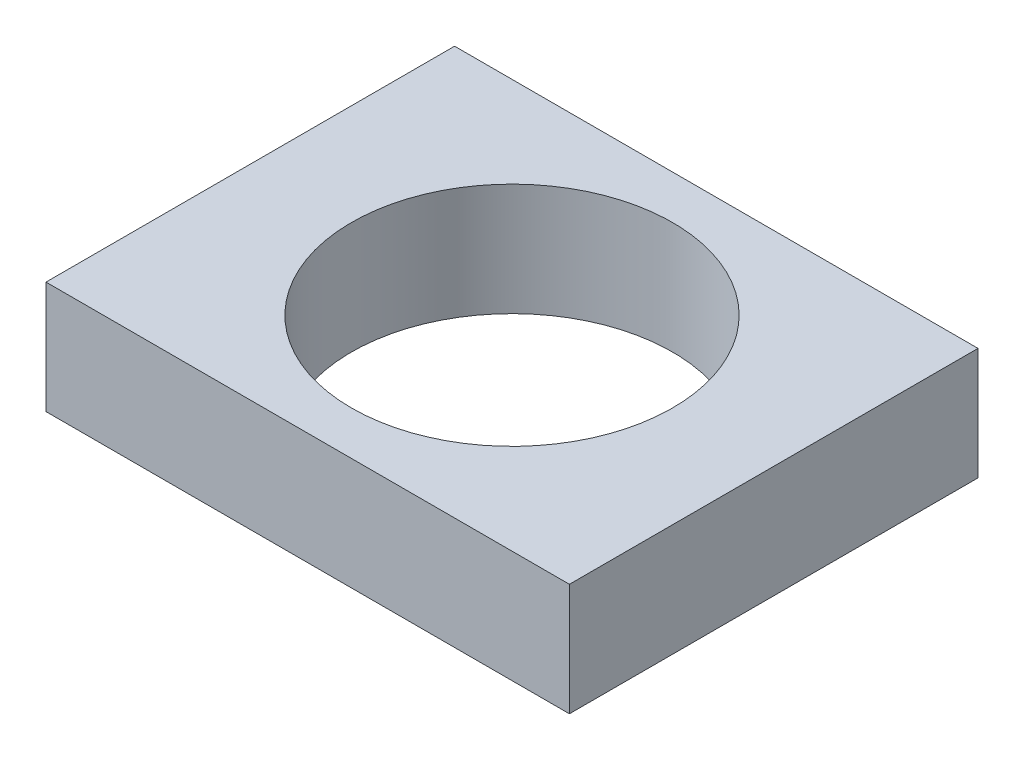
ISO-10303-21;
HEADER;
FILE_DESCRIPTION(('STEP AP214'),'2;1');
FILE_NAME('part.step','',(''),(''),'','','');
FILE_SCHEMA(('AUTOMOTIVE_DESIGN { 1 0 10303 214 1 1 1 1 }'));
ENDSEC;
DATA;
#1=APPLICATION_CONTEXT('core data for automotive mechanical design processes');
#2=APPLICATION_PROTOCOL_DEFINITION('international standard','automotive_design',2000,#1);
#3=PRODUCT_CONTEXT('',#1,'mechanical');
#4=PRODUCT('Part','Part','',(#3));
#5=PRODUCT_RELATED_PRODUCT_CATEGORY('part','',(#4));
#6=PRODUCT_DEFINITION_FORMATION('','',#4);
#7=PRODUCT_DEFINITION_CONTEXT('part definition',#1,'design');
#8=PRODUCT_DEFINITION('design','',#6,#7);
#9=PRODUCT_DEFINITION_SHAPE('','',#8);
#10=(LENGTH_UNIT() NAMED_UNIT(*) SI_UNIT(.MILLI.,.METRE.));
#11=(NAMED_UNIT(*) PLANE_ANGLE_UNIT() SI_UNIT($,.RADIAN.));
#12=(NAMED_UNIT(*) SI_UNIT($,.STERADIAN.) SOLID_ANGLE_UNIT());
#13=UNCERTAINTY_MEASURE_WITH_UNIT(LENGTH_MEASURE(1.E-05),#10,'distance_accuracy_value','');
#14=(GEOMETRIC_REPRESENTATION_CONTEXT(3) GLOBAL_UNCERTAINTY_ASSIGNED_CONTEXT((#13)) GLOBAL_UNIT_ASSIGNED_CONTEXT((#10,
#11,#12)) REPRESENTATION_CONTEXT('',''));
#15=CARTESIAN_POINT('',(0.,0.,0.));
#16=DIRECTION('',(0.,0.,1.));
#17=DIRECTION('',(1.,0.,0.));
#18=AXIS2_PLACEMENT_3D('',#15,#16,#17);
#19=CARTESIAN_POINT('',(0.,-12.7,0.));
#20=DIRECTION('',(-1.,0.,0.));
#21=DIRECTION('',(0.,0.,1.));
#22=AXIS2_PLACEMENT_3D('',#19,#20,#21);
#23=PLANE('',#22);
#24=DIRECTION('',(0.,0.,1.));
#25=VECTOR('',#24,1.);
#26=CARTESIAN_POINT('',(0.,0.,0.));
#27=LINE('',#26,#25);
#28=CARTESIAN_POINT('',(0.,0.,-46.256497387282));
#29=VERTEX_POINT('',#28);
#30=CARTESIAN_POINT('',(0.,0.,0.));
#31=VERTEX_POINT('',#30);
#32=EDGE_CURVE('E96',#29,#31,#27,.T.);
#33=ORIENTED_EDGE('',*,*,#32,.F.);
#34=DIRECTION('',(0.,1.,0.));
#35=VECTOR('',#34,1.);
#36=CARTESIAN_POINT('',(0.,-12.7,-46.256497387282));
#37=LINE('',#36,#35);
#38=CARTESIAN_POINT('',(0.,-12.7,-46.256497387282));
#39=VERTEX_POINT('',#38);
#40=EDGE_CURVE('E11',#39,#29,#37,.T.);
#41=ORIENTED_EDGE('',*,*,#40,.F.);
#42=DIRECTION('',(0.,0.,1.));
#43=VECTOR('',#42,1.);
#44=CARTESIAN_POINT('',(0.,-12.7,0.));
#45=LINE('',#44,#43);
#46=CARTESIAN_POINT('',(0.,-12.7,0.));
#47=VERTEX_POINT('',#46);
#48=EDGE_CURVE('E89',#39,#47,#45,.T.);
#49=ORIENTED_EDGE('',*,*,#48,.T.);
#50=DIRECTION('',(0.,1.,0.));
#51=VECTOR('',#50,1.);
#52=CARTESIAN_POINT('',(0.,-12.7,0.));
#53=LINE('',#52,#51);
#54=EDGE_CURVE('E34',#47,#31,#53,.T.);
#55=ORIENTED_EDGE('',*,*,#54,.T.);
#56=EDGE_LOOP('',(#33,#41,#49,#55));
#57=FACE_BOUND('',#56,.T.);
#58=ADVANCED_FACE('F31',(#57),#23,.T.);
#59=CARTESIAN_POINT('',(0.,-12.7,-46.256497387282));
#60=DIRECTION('',(0.,0.,-1.));
#61=DIRECTION('',(-1.,0.,0.));
#62=AXIS2_PLACEMENT_3D('',#59,#60,#61);
#63=PLANE('',#62);
#64=DIRECTION('',(-1.,0.,0.));
#65=VECTOR('',#64,1.);
#66=CARTESIAN_POINT('',(0.,0.,-46.256497387282));
#67=LINE('',#66,#65);
#68=CARTESIAN_POINT('',(59.255118265633,0.,-46.256497387282));
#69=VERTEX_POINT('',#68);
#70=EDGE_CURVE('E91',#69,#29,#67,.T.);
#71=ORIENTED_EDGE('',*,*,#70,.F.);
#72=DIRECTION('',(0.,1.,0.));
#73=VECTOR('',#72,1.);
#74=CARTESIAN_POINT('',(59.255118265633,-12.7,-46.256497387282));
#75=LINE('',#74,#73);
#76=CARTESIAN_POINT('',(59.255118265633,-12.7,-46.256497387282));
#77=VERTEX_POINT('',#76);
#78=EDGE_CURVE('E40',#77,#69,#75,.T.);
#79=ORIENTED_EDGE('',*,*,#78,.F.);
#80=DIRECTION('',(-1.,0.,0.));
#81=VECTOR('',#80,1.);
#82=CARTESIAN_POINT('',(0.,-12.7,-46.256497387282));
#83=LINE('',#82,#81);
#84=EDGE_CURVE('E86',#77,#39,#83,.T.);
#85=ORIENTED_EDGE('',*,*,#84,.T.);
#86=ORIENTED_EDGE('',*,*,#40,.T.);
#87=EDGE_LOOP('',(#71,#79,#85,#86));
#88=FACE_BOUND('',#87,.T.);
#89=ADVANCED_FACE('F107',(#88),#63,.T.);
#90=CARTESIAN_POINT('',(59.255118265633,-12.7,0.));
#91=DIRECTION('',(1.,0.,0.));
#92=DIRECTION('',(0.,0.,-1.));
#93=AXIS2_PLACEMENT_3D('',#90,#91,#92);
#94=PLANE('',#93);
#95=DIRECTION('',(0.,0.,-1.));
#96=VECTOR('',#95,1.);
#97=CARTESIAN_POINT('',(59.255118265633,0.,0.));
#98=LINE('',#97,#96);
#99=CARTESIAN_POINT('',(59.255118265633,0.,0.));
#100=VERTEX_POINT('',#99);
#101=EDGE_CURVE('E81',#100,#69,#98,.T.);
#102=ORIENTED_EDGE('',*,*,#101,.F.);
#103=DIRECTION('',(0.,1.,0.));
#104=VECTOR('',#103,1.);
#105=CARTESIAN_POINT('',(59.255118265633,-12.7,0.));
#106=LINE('',#105,#104);
#107=CARTESIAN_POINT('',(59.255118265633,-12.7,0.));
#108=VERTEX_POINT('',#107);
#109=EDGE_CURVE('E76',#108,#100,#106,.T.);
#110=ORIENTED_EDGE('',*,*,#109,.F.);
#111=DIRECTION('',(0.,0.,-1.));
#112=VECTOR('',#111,1.);
#113=CARTESIAN_POINT('',(59.255118265633,-12.7,0.));
#114=LINE('',#113,#112);
#115=EDGE_CURVE('E79',#108,#77,#114,.T.);
#116=ORIENTED_EDGE('',*,*,#115,.T.);
#117=ORIENTED_EDGE('',*,*,#78,.T.);
#118=EDGE_LOOP('',(#102,#110,#116,#117));
#119=FACE_BOUND('',#118,.T.);
#120=ADVANCED_FACE('F78',(#119),#94,.T.);
#121=CARTESIAN_POINT('',(0.,-12.7,0.));
#122=DIRECTION('',(0.,0.,1.));
#123=DIRECTION('',(1.,0.,0.));
#124=AXIS2_PLACEMENT_3D('',#121,#122,#123);
#125=PLANE('',#124);
#126=DIRECTION('',(1.,0.,0.));
#127=VECTOR('',#126,1.);
#128=CARTESIAN_POINT('',(0.,0.,0.));
#129=LINE('',#128,#127);
#130=EDGE_CURVE('E99',#31,#100,#129,.T.);
#131=ORIENTED_EDGE('',*,*,#130,.F.);
#132=ORIENTED_EDGE('',*,*,#54,.F.);
#133=DIRECTION('',(1.,0.,0.));
#134=VECTOR('',#133,1.);
#135=CARTESIAN_POINT('',(0.,-12.7,0.));
#136=LINE('',#135,#134);
#137=EDGE_CURVE('E85',#47,#108,#136,.T.);
#138=ORIENTED_EDGE('',*,*,#137,.T.);
#139=ORIENTED_EDGE('',*,*,#109,.T.);
#140=EDGE_LOOP('',(#131,#132,#138,#139));
#141=FACE_BOUND('',#140,.T.);
#142=ADVANCED_FACE('F88',(#141),#125,.T.);
#143=CARTESIAN_POINT('',(0.,-12.7,-46.256497387282));
#144=DIRECTION('',(0.,-1.,0.));
#145=DIRECTION('',(0.,0.,-1.));
#146=AXIS2_PLACEMENT_3D('',#143,#144,#145);
#147=PLANE('',#146);
#148=CARTESIAN_POINT('',(29.6275591328165,-12.7,-23.128248693641));
#149=DIRECTION('',(0.,1.,0.));
#150=DIRECTION('',(0.,0.,1.));
#151=AXIS2_PLACEMENT_3D('',#148,#149,#150);
#152=CIRCLE('',#151,18.1821654953049);
#153=CARTESIAN_POINT('',(29.6275591328165,-12.7,-4.94608319833616));
#154=VERTEX_POINT('',#153);
#155=EDGE_CURVE('E100',#154,#154,#152,.T.);
#156=ORIENTED_EDGE('',*,*,#155,.T.);
#157=EDGE_LOOP('',(#156));
#158=FACE_BOUND('',#157,.T.);
#159=ORIENTED_EDGE('',*,*,#48,.F.);
#160=ORIENTED_EDGE('',*,*,#84,.F.);
#161=ORIENTED_EDGE('',*,*,#115,.F.);
#162=ORIENTED_EDGE('',*,*,#137,.F.);
#163=EDGE_LOOP('',(#159,#160,#161,#162));
#164=FACE_BOUND('',#163,.T.);
#165=ADVANCED_FACE('F84',(#158,#164),#147,.T.);
#166=CARTESIAN_POINT('',(0.,0.,-46.256497387282));
#167=DIRECTION('',(0.,-1.,0.));
#168=DIRECTION('',(0.,0.,-1.));
#169=AXIS2_PLACEMENT_3D('',#166,#167,#168);
#170=PLANE('',#169);
#171=CARTESIAN_POINT('',(29.6275591328165,0.,-23.128248693641));
#172=DIRECTION('',(0.,1.,0.));
#173=DIRECTION('',(0.,0.,1.));
#174=AXIS2_PLACEMENT_3D('',#171,#172,#173);
#175=CIRCLE('',#174,18.1821654953049);
#176=CARTESIAN_POINT('',(29.6275591328165,0.,-4.94608319833616));
#177=VERTEX_POINT('',#176);
#178=EDGE_CURVE('E137',#177,#177,#175,.T.);
#179=ORIENTED_EDGE('',*,*,#178,.F.);
#180=EDGE_LOOP('',(#179));
#181=FACE_BOUND('',#180,.T.);
#182=ORIENTED_EDGE('',*,*,#32,.T.);
#183=ORIENTED_EDGE('',*,*,#130,.T.);
#184=ORIENTED_EDGE('',*,*,#101,.T.);
#185=ORIENTED_EDGE('',*,*,#70,.T.);
#186=EDGE_LOOP('',(#182,#183,#184,#185));
#187=FACE_BOUND('',#186,.T.);
#188=ADVANCED_FACE('F106',(#181,#187),#170,.F.);
#189=CARTESIAN_POINT('',(29.6275591328165,-12.7,-23.128248693641));
#190=DIRECTION('',(0.,1.,0.));
#191=DIRECTION('',(0.,0.,1.));
#192=AXIS2_PLACEMENT_3D('',#189,#190,#191);
#193=CYLINDRICAL_SURFACE('',#192,18.1821654953049);
#194=ORIENTED_EDGE('',*,*,#155,.F.);
#195=EDGE_LOOP('',(#194));
#196=FACE_BOUND('',#195,.T.);
#197=ORIENTED_EDGE('',*,*,#178,.T.);
#198=EDGE_LOOP('',(#197));
#199=FACE_BOUND('',#198,.T.);
#200=ADVANCED_FACE('F125',(#196,#199),#193,.F.);
#201=CLOSED_SHELL('',(#58,#89,#120,#142,#165,#188,#200));
#202=MANIFOLD_SOLID_BREP('B2',#201);
#203=ADVANCED_BREP_SHAPE_REPRESENTATION('',(#18,#202),#14);
#204=SHAPE_DEFINITION_REPRESENTATION(#9,#203);
ENDSEC;
END-ISO-10303-21;
